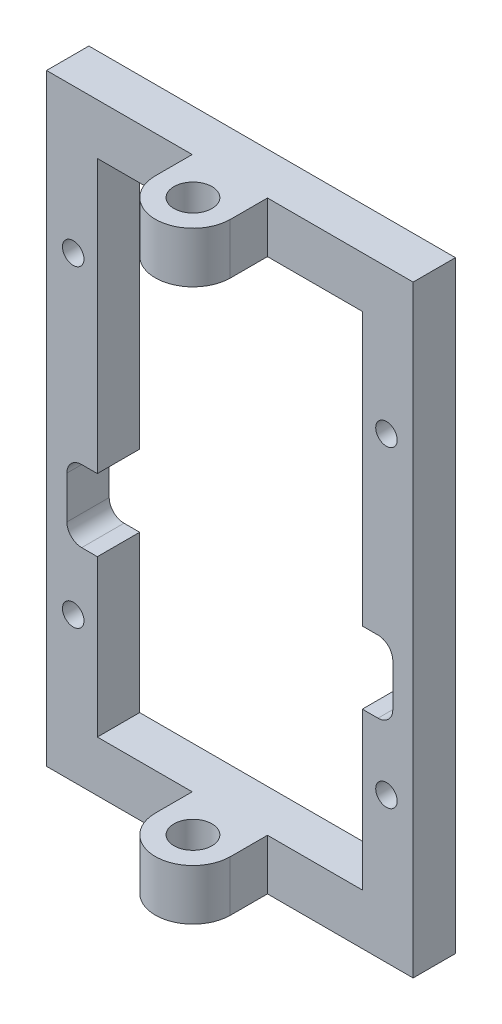
ISO-10303-21;
HEADER;
FILE_DESCRIPTION(('STEP AP214'),'2;1');
FILE_NAME('part.step','',(''),(''),'','','');
FILE_SCHEMA(('AUTOMOTIVE_DESIGN { 1 0 10303 214 1 1 1 1 }'));
ENDSEC;
DATA;
#1=APPLICATION_CONTEXT('core data for automotive mechanical design processes');
#2=APPLICATION_PROTOCOL_DEFINITION('international standard','automotive_design',2000,#1);
#3=PRODUCT_CONTEXT('',#1,'mechanical');
#4=PRODUCT('Part','Part','',(#3));
#5=PRODUCT_RELATED_PRODUCT_CATEGORY('part','',(#4));
#6=PRODUCT_DEFINITION_FORMATION('','',#4);
#7=PRODUCT_DEFINITION_CONTEXT('part definition',#1,'design');
#8=PRODUCT_DEFINITION('design','',#6,#7);
#9=PRODUCT_DEFINITION_SHAPE('','',#8);
#10=(LENGTH_UNIT() NAMED_UNIT(*) SI_UNIT(.MILLI.,.METRE.));
#11=(NAMED_UNIT(*) PLANE_ANGLE_UNIT() SI_UNIT($,.RADIAN.));
#12=(NAMED_UNIT(*) SI_UNIT($,.STERADIAN.) SOLID_ANGLE_UNIT());
#13=UNCERTAINTY_MEASURE_WITH_UNIT(LENGTH_MEASURE(1.E-05),#10,'distance_accuracy_value','');
#14=(GEOMETRIC_REPRESENTATION_CONTEXT(3) GLOBAL_UNCERTAINTY_ASSIGNED_CONTEXT((#13)) GLOBAL_UNIT_ASSIGNED_CONTEXT((#10,
#11,#12)) REPRESENTATION_CONTEXT('',''));
#15=CARTESIAN_POINT('',(0.,0.,0.));
#16=DIRECTION('',(0.,0.,1.));
#17=DIRECTION('',(1.,0.,0.));
#18=AXIS2_PLACEMENT_3D('',#15,#16,#17);
#19=CARTESIAN_POINT('',(0.,0.,5.));
#20=DIRECTION('',(0.,0.,1.));
#21=DIRECTION('',(1.,0.,0.));
#22=AXIS2_PLACEMENT_3D('',#19,#20,#21);
#23=PLANE('',#22);
#24=CARTESIAN_POINT('',(-18.5,-18.495,5.));
#25=DIRECTION('',(0.,0.,-1.));
#26=DIRECTION('',(-1.,0.,0.));
#27=AXIS2_PLACEMENT_3D('',#24,#25,#26);
#28=CIRCLE('',#27,1.27);
#29=CARTESIAN_POINT('',(-19.77,-18.495,5.));
#30=VERTEX_POINT('',#29);
#31=EDGE_CURVE('E745',#30,#30,#28,.T.);
#32=ORIENTED_EDGE('',*,*,#31,.T.);
#33=EDGE_LOOP('',(#32));
#34=FACE_BOUND('',#33,.T.);
#35=CARTESIAN_POINT('',(-18.5,18.495,5.));
#36=DIRECTION('',(0.,0.,-1.));
#37=DIRECTION('',(-1.,0.,0.));
#38=AXIS2_PLACEMENT_3D('',#35,#36,#37);
#39=CIRCLE('',#38,1.27);
#40=CARTESIAN_POINT('',(-19.77,18.495,5.));
#41=VERTEX_POINT('',#40);
#42=EDGE_CURVE('E791',#41,#41,#39,.T.);
#43=ORIENTED_EDGE('',*,*,#42,.T.);
#44=EDGE_LOOP('',(#43));
#45=FACE_BOUND('',#44,.T.);
#46=DIRECTION('',(0.,-1.,0.));
#47=VECTOR('',#46,1.);
#48=CARTESIAN_POINT('',(-15.65,29.595,5.));
#49=LINE('',#48,#47);
#50=CARTESIAN_POINT('',(-15.65,-11.145,5.));
#51=VERTEX_POINT('',#50);
#52=CARTESIAN_POINT('',(-15.65,-29.595,5.));
#53=VERTEX_POINT('',#52);
#54=EDGE_CURVE('E511',#51,#53,#49,.T.);
#55=ORIENTED_EDGE('',*,*,#54,.F.);
#56=DIRECTION('',(1.,0.,0.));
#57=VECTOR('',#56,1.);
#58=CARTESIAN_POINT('',(0.,-11.145,5.));
#59=LINE('',#58,#57);
#60=CARTESIAN_POINT('',(-17.5,-11.145,5.));
#61=VERTEX_POINT('',#60);
#62=EDGE_CURVE('E349',#61,#51,#59,.T.);
#63=ORIENTED_EDGE('',*,*,#62,.F.);
#64=CARTESIAN_POINT('',(-17.5,-9.395,5.));
#65=DIRECTION('',(0.,0.,-1.));
#66=DIRECTION('',(-1.,0.,0.));
#67=AXIS2_PLACEMENT_3D('',#64,#65,#66);
#68=CIRCLE('',#67,1.75);
#69=CARTESIAN_POINT('',(-19.25,-9.395,5.));
#70=VERTEX_POINT('',#69);
#71=EDGE_CURVE('E318',#61,#70,#68,.T.);
#72=ORIENTED_EDGE('',*,*,#71,.T.);
#73=DIRECTION('',(0.,-1.,0.));
#74=VECTOR('',#73,1.);
#75=CARTESIAN_POINT('',(-19.25,0.,5.));
#76=LINE('',#75,#74);
#77=CARTESIAN_POINT('',(-19.25,-4.395,5.));
#78=VERTEX_POINT('',#77);
#79=EDGE_CURVE('E361',#78,#70,#76,.T.);
#80=ORIENTED_EDGE('',*,*,#79,.F.);
#81=CARTESIAN_POINT('',(-17.5,-4.395,5.));
#82=DIRECTION('',(0.,0.,-1.));
#83=DIRECTION('',(-1.,0.,0.));
#84=AXIS2_PLACEMENT_3D('',#81,#82,#83);
#85=CIRCLE('',#84,1.75);
#86=CARTESIAN_POINT('',(-17.5,-2.645,5.));
#87=VERTEX_POINT('',#86);
#88=EDGE_CURVE('E357',#78,#87,#85,.T.);
#89=ORIENTED_EDGE('',*,*,#88,.T.);
#90=DIRECTION('',(1.,0.,0.));
#91=VECTOR('',#90,1.);
#92=CARTESIAN_POINT('',(0.,-2.64499999999999,5.));
#93=LINE('',#92,#91);
#94=CARTESIAN_POINT('',(-15.65,-2.645,5.));
#95=VERTEX_POINT('',#94);
#96=EDGE_CURVE('E352',#87,#95,#93,.T.);
#97=ORIENTED_EDGE('',*,*,#96,.T.);
#98=CARTESIAN_POINT('',(-15.65,29.595,5.));
#99=VERTEX_POINT('',#98);
#100=EDGE_CURVE('E506',#99,#95,#49,.T.);
#101=ORIENTED_EDGE('',*,*,#100,.F.);
#102=DIRECTION('',(-1.,0.,0.));
#103=VECTOR('',#102,1.);
#104=CARTESIAN_POINT('',(-15.65,29.595,5.));
#105=LINE('',#104,#103);
#106=CARTESIAN_POINT('',(-4.445,29.595,5.));
#107=VERTEX_POINT('',#106);
#108=EDGE_CURVE('E521',#107,#99,#105,.T.);
#109=ORIENTED_EDGE('',*,*,#108,.F.);
#110=DIRECTION('',(0.,-1.,0.));
#111=VECTOR('',#110,1.);
#112=CARTESIAN_POINT('',(-4.445,35.595,5.));
#113=LINE('',#112,#111);
#114=CARTESIAN_POINT('',(-4.445,35.595,5.));
#115=VERTEX_POINT('',#114);
#116=EDGE_CURVE('E485',#115,#107,#113,.T.);
#117=ORIENTED_EDGE('',*,*,#116,.F.);
#118=DIRECTION('',(-1.,0.,0.));
#119=VECTOR('',#118,1.);
#120=CARTESIAN_POINT('',(-21.65,35.595,5.));
#121=LINE('',#120,#119);
#122=CARTESIAN_POINT('',(-21.65,35.595,5.));
#123=VERTEX_POINT('',#122);
#124=EDGE_CURVE('E572',#115,#123,#121,.T.);
#125=ORIENTED_EDGE('',*,*,#124,.T.);
#126=DIRECTION('',(0.,-1.,0.));
#127=VECTOR('',#126,1.);
#128=CARTESIAN_POINT('',(-21.65,35.595,5.));
#129=LINE('',#128,#127);
#130=CARTESIAN_POINT('',(-21.65,-35.595,5.));
#131=VERTEX_POINT('',#130);
#132=EDGE_CURVE('E559',#123,#131,#129,.T.);
#133=ORIENTED_EDGE('',*,*,#132,.T.);
#134=DIRECTION('',(1.,0.,0.));
#135=VECTOR('',#134,1.);
#136=CARTESIAN_POINT('',(-21.65,-35.595,5.));
#137=LINE('',#136,#135);
#138=CARTESIAN_POINT('',(-4.445,-35.595,5.));
#139=VERTEX_POINT('',#138);
#140=EDGE_CURVE('E565',#131,#139,#137,.T.);
#141=ORIENTED_EDGE('',*,*,#140,.T.);
#142=DIRECTION('',(0.,-1.,0.));
#143=VECTOR('',#142,1.);
#144=CARTESIAN_POINT('',(-4.445,-29.595,5.));
#145=LINE('',#144,#143);
#146=CARTESIAN_POINT('',(-4.445,-29.595,5.));
#147=VERTEX_POINT('',#146);
#148=EDGE_CURVE('E481',#147,#139,#145,.T.);
#149=ORIENTED_EDGE('',*,*,#148,.F.);
#150=DIRECTION('',(1.,0.,0.));
#151=VECTOR('',#150,1.);
#152=CARTESIAN_POINT('',(-15.65,-29.595,5.));
#153=LINE('',#152,#151);
#154=EDGE_CURVE('E512',#53,#147,#153,.T.);
#155=ORIENTED_EDGE('',*,*,#154,.F.);
#156=EDGE_LOOP('',(#55,#63,#72,#80,#89,#97,#101,#109,#117,#125,#133,#141,#149,#155));
#157=FACE_BOUND('',#156,.T.);
#158=ADVANCED_FACE('F122',(#34,#45,#157),#23,.T.);
#159=CARTESIAN_POINT('',(18.5,18.49499991,5.));
#160=DIRECTION('',(0.,0.,-1.));
#161=DIRECTION('',(-1.,0.,0.));
#162=AXIS2_PLACEMENT_3D('',#159,#160,#161);
#163=CIRCLE('',#162,1.27);
#164=CARTESIAN_POINT('',(17.23,18.49499991,5.));
#165=VERTEX_POINT('',#164);
#166=EDGE_CURVE('E369',#165,#165,#163,.T.);
#167=ORIENTED_EDGE('',*,*,#166,.T.);
#168=EDGE_LOOP('',(#167));
#169=FACE_BOUND('',#168,.T.);
#170=CARTESIAN_POINT('',(18.49999995,-18.4398880645368,5.));
#171=DIRECTION('',(0.,0.,-1.));
#172=DIRECTION('',(-1.,0.,0.));
#173=AXIS2_PLACEMENT_3D('',#170,#171,#172);
#174=CIRCLE('',#173,1.27);
#175=CARTESIAN_POINT('',(17.22999995,-18.4398880645368,5.));
#176=VERTEX_POINT('',#175);
#177=EDGE_CURVE('E780',#176,#176,#174,.T.);
#178=ORIENTED_EDGE('',*,*,#177,.T.);
#179=EDGE_LOOP('',(#178));
#180=FACE_BOUND('',#179,.T.);
#181=DIRECTION('',(0.,1.,0.));
#182=VECTOR('',#181,1.);
#183=CARTESIAN_POINT('',(15.65,29.595,5.));
#184=LINE('',#183,#182);
#185=CARTESIAN_POINT('',(15.65,-2.58988806453678,5.));
#186=VERTEX_POINT('',#185);
#187=CARTESIAN_POINT('',(15.65,29.595,5.));
#188=VERTEX_POINT('',#187);
#189=EDGE_CURVE('E516',#186,#188,#184,.T.);
#190=ORIENTED_EDGE('',*,*,#189,.F.);
#191=DIRECTION('',(-1.,0.,0.));
#192=VECTOR('',#191,1.);
#193=CARTESIAN_POINT('',(0.,-2.58988806453677,5.));
#194=LINE('',#193,#192);
#195=CARTESIAN_POINT('',(17.5,-2.58988806453678,5.));
#196=VERTEX_POINT('',#195);
#197=EDGE_CURVE('E374',#196,#186,#194,.T.);
#198=ORIENTED_EDGE('',*,*,#197,.F.);
#199=CARTESIAN_POINT('',(17.5,-4.33988806453679,5.));
#200=DIRECTION('',(0.,0.,-1.));
#201=DIRECTION('',(-1.,0.,0.));
#202=AXIS2_PLACEMENT_3D('',#199,#200,#201);
#203=CIRCLE('',#202,1.75);
#204=CARTESIAN_POINT('',(19.25,-4.33988806453679,5.));
#205=VERTEX_POINT('',#204);
#206=EDGE_CURVE('E377',#196,#205,#203,.T.);
#207=ORIENTED_EDGE('',*,*,#206,.T.);
#208=DIRECTION('',(0.,-1.,0.));
#209=VECTOR('',#208,1.);
#210=CARTESIAN_POINT('',(19.25,0.,5.));
#211=LINE('',#210,#209);
#212=CARTESIAN_POINT('',(19.25,-9.33988806453679,5.));
#213=VERTEX_POINT('',#212);
#214=EDGE_CURVE('E381',#205,#213,#211,.T.);
#215=ORIENTED_EDGE('',*,*,#214,.T.);
#216=CARTESIAN_POINT('',(17.5,-9.33988806453679,5.));
#217=DIRECTION('',(0.,0.,-1.));
#218=DIRECTION('',(-1.,0.,0.));
#219=AXIS2_PLACEMENT_3D('',#216,#217,#218);
#220=CIRCLE('',#219,1.75);
#221=CARTESIAN_POINT('',(17.5,-11.0898880645368,5.));
#222=VERTEX_POINT('',#221);
#223=EDGE_CURVE('E385',#213,#222,#220,.T.);
#224=ORIENTED_EDGE('',*,*,#223,.T.);
#225=DIRECTION('',(-1.,0.,0.));
#226=VECTOR('',#225,1.);
#227=CARTESIAN_POINT('',(0.,-11.0898880645368,5.));
#228=LINE('',#227,#226);
#229=CARTESIAN_POINT('',(15.65,-11.0898880645368,5.));
#230=VERTEX_POINT('',#229);
#231=EDGE_CURVE('E389',#222,#230,#228,.T.);
#232=ORIENTED_EDGE('',*,*,#231,.T.);
#233=CARTESIAN_POINT('',(15.65,-29.595,5.));
#234=VERTEX_POINT('',#233);
#235=EDGE_CURVE('E517',#234,#230,#184,.T.);
#236=ORIENTED_EDGE('',*,*,#235,.F.);
#237=CARTESIAN_POINT('',(4.445,-29.595,5.));
#238=VERTEX_POINT('',#237);
#239=EDGE_CURVE('E510',#238,#234,#153,.T.);
#240=ORIENTED_EDGE('',*,*,#239,.F.);
#241=DIRECTION('',(0.,-1.,0.));
#242=VECTOR('',#241,1.);
#243=CARTESIAN_POINT('',(4.445,-29.595,5.));
#244=LINE('',#243,#242);
#245=CARTESIAN_POINT('',(4.445,-35.595,5.));
#246=VERTEX_POINT('',#245);
#247=EDGE_CURVE('E477',#238,#246,#244,.T.);
#248=ORIENTED_EDGE('',*,*,#247,.T.);
#249=CARTESIAN_POINT('',(21.65,-35.595,5.));
#250=VERTEX_POINT('',#249);
#251=EDGE_CURVE('E563',#246,#250,#137,.T.);
#252=ORIENTED_EDGE('',*,*,#251,.T.);
#253=DIRECTION('',(0.,1.,0.));
#254=VECTOR('',#253,1.);
#255=CARTESIAN_POINT('',(21.65,35.595,5.));
#256=LINE('',#255,#254);
#257=CARTESIAN_POINT('',(21.65,35.595,5.));
#258=VERTEX_POINT('',#257);
#259=EDGE_CURVE('E569',#250,#258,#256,.T.);
#260=ORIENTED_EDGE('',*,*,#259,.T.);
#261=CARTESIAN_POINT('',(4.445,35.595,5.));
#262=VERTEX_POINT('',#261);
#263=EDGE_CURVE('E573',#258,#262,#121,.T.);
#264=ORIENTED_EDGE('',*,*,#263,.T.);
#265=DIRECTION('',(0.,-1.,0.));
#266=VECTOR('',#265,1.);
#267=CARTESIAN_POINT('',(4.445,35.595,5.));
#268=LINE('',#267,#266);
#269=CARTESIAN_POINT('',(4.445,29.595,5.));
#270=VERTEX_POINT('',#269);
#271=EDGE_CURVE('E489',#262,#270,#268,.T.);
#272=ORIENTED_EDGE('',*,*,#271,.T.);
#273=EDGE_CURVE('E522',#188,#270,#105,.T.);
#274=ORIENTED_EDGE('',*,*,#273,.F.);
#275=EDGE_LOOP('',(#190,#198,#207,#215,#224,#232,#236,#240,#248,#252,#260,#264,#272,#274));
#276=FACE_BOUND('',#275,.T.);
#277=ADVANCED_FACE('F624',(#169,#180,#276),#23,.T.);
#278=CARTESIAN_POINT('',(0.,0.,0.));
#279=DIRECTION('',(0.,0.,1.));
#280=DIRECTION('',(1.,0.,0.));
#281=AXIS2_PLACEMENT_3D('',#278,#279,#280);
#282=PLANE('',#281);
#283=CARTESIAN_POINT('',(-18.5,-18.495,0.));
#284=DIRECTION('',(0.,0.,-1.));
#285=DIRECTION('',(-1.,0.,0.));
#286=AXIS2_PLACEMENT_3D('',#283,#284,#285);
#287=CIRCLE('',#286,1.27);
#288=CARTESIAN_POINT('',(-19.77,-18.495,0.));
#289=VERTEX_POINT('',#288);
#290=EDGE_CURVE('E784',#289,#289,#287,.T.);
#291=ORIENTED_EDGE('',*,*,#290,.F.);
#292=EDGE_LOOP('',(#291));
#293=FACE_BOUND('',#292,.T.);
#294=CARTESIAN_POINT('',(-18.5,18.495,0.));
#295=DIRECTION('',(0.,0.,-1.));
#296=DIRECTION('',(-1.,0.,0.));
#297=AXIS2_PLACEMENT_3D('',#294,#295,#296);
#298=CIRCLE('',#297,1.27);
#299=CARTESIAN_POINT('',(-19.77,18.495,0.));
#300=VERTEX_POINT('',#299);
#301=EDGE_CURVE('E373',#300,#300,#298,.T.);
#302=ORIENTED_EDGE('',*,*,#301,.F.);
#303=EDGE_LOOP('',(#302));
#304=FACE_BOUND('',#303,.T.);
#305=CARTESIAN_POINT('',(18.5,18.49499991,0.));
#306=DIRECTION('',(0.,0.,-1.));
#307=DIRECTION('',(-1.,0.,0.));
#308=AXIS2_PLACEMENT_3D('',#305,#306,#307);
#309=CIRCLE('',#308,1.27);
#310=CARTESIAN_POINT('',(17.23,18.49499991,0.));
#311=VERTEX_POINT('',#310);
#312=EDGE_CURVE('E323',#311,#311,#309,.T.);
#313=ORIENTED_EDGE('',*,*,#312,.F.);
#314=EDGE_LOOP('',(#313));
#315=FACE_BOUND('',#314,.T.);
#316=DIRECTION('',(0.,-1.,0.));
#317=VECTOR('',#316,1.);
#318=CARTESIAN_POINT('',(-21.65,35.595,0.));
#319=LINE('',#318,#317);
#320=CARTESIAN_POINT('',(-21.65,35.595,0.));
#321=VERTEX_POINT('',#320);
#322=CARTESIAN_POINT('',(-21.65,-35.595,0.));
#323=VERTEX_POINT('',#322);
#324=EDGE_CURVE('E558',#321,#323,#319,.T.);
#325=ORIENTED_EDGE('',*,*,#324,.F.);
#326=DIRECTION('',(-1.,0.,0.));
#327=VECTOR('',#326,1.);
#328=CARTESIAN_POINT('',(-21.65,35.595,0.));
#329=LINE('',#328,#327);
#330=CARTESIAN_POINT('',(21.65,35.595,0.));
#331=VERTEX_POINT('',#330);
#332=EDGE_CURVE('E564',#331,#321,#329,.T.);
#333=ORIENTED_EDGE('',*,*,#332,.F.);
#334=DIRECTION('',(0.,1.,0.));
#335=VECTOR('',#334,1.);
#336=CARTESIAN_POINT('',(21.65,35.595,0.));
#337=LINE('',#336,#335);
#338=CARTESIAN_POINT('',(21.65,-35.595,0.));
#339=VERTEX_POINT('',#338);
#340=EDGE_CURVE('E584',#339,#331,#337,.T.);
#341=ORIENTED_EDGE('',*,*,#340,.F.);
#342=DIRECTION('',(1.,0.,0.));
#343=VECTOR('',#342,1.);
#344=CARTESIAN_POINT('',(-21.65,-35.595,0.));
#345=LINE('',#344,#343);
#346=EDGE_CURVE('E581',#323,#339,#345,.T.);
#347=ORIENTED_EDGE('',*,*,#346,.F.);
#348=EDGE_LOOP('',(#325,#333,#341,#347));
#349=FACE_BOUND('',#348,.T.);
#350=CARTESIAN_POINT('',(18.49999995,-18.4398880645368,0.));
#351=DIRECTION('',(0.,0.,-1.));
#352=DIRECTION('',(-1.,0.,0.));
#353=AXIS2_PLACEMENT_3D('',#350,#351,#352);
#354=CIRCLE('',#353,1.27);
#355=CARTESIAN_POINT('',(17.22999995,-18.4398880645368,0.));
#356=VERTEX_POINT('',#355);
#357=EDGE_CURVE('E777',#356,#356,#354,.T.);
#358=ORIENTED_EDGE('',*,*,#357,.F.);
#359=EDGE_LOOP('',(#358));
#360=FACE_BOUND('',#359,.T.);
#361=DIRECTION('',(1.,0.,0.));
#362=VECTOR('',#361,1.);
#363=CARTESIAN_POINT('',(0.,-11.145,0.));
#364=LINE('',#363,#362);
#365=CARTESIAN_POINT('',(-17.5,-11.145,0.));
#366=VERTEX_POINT('',#365);
#367=CARTESIAN_POINT('',(-15.65,-11.145,0.));
#368=VERTEX_POINT('',#367);
#369=EDGE_CURVE('E326',#366,#368,#364,.T.);
#370=ORIENTED_EDGE('',*,*,#369,.T.);
#371=DIRECTION('',(0.,-1.,0.));
#372=VECTOR('',#371,1.);
#373=CARTESIAN_POINT('',(-15.65,29.595,0.));
#374=LINE('',#373,#372);
#375=CARTESIAN_POINT('',(-15.65,-29.595,0.));
#376=VERTEX_POINT('',#375);
#377=EDGE_CURVE('E505',#368,#376,#374,.T.);
#378=ORIENTED_EDGE('',*,*,#377,.T.);
#379=DIRECTION('',(1.,0.,0.));
#380=VECTOR('',#379,1.);
#381=CARTESIAN_POINT('',(-15.65,-29.595,0.));
#382=LINE('',#381,#380);
#383=CARTESIAN_POINT('',(15.65,-29.595,0.));
#384=VERTEX_POINT('',#383);
#385=EDGE_CURVE('E531',#376,#384,#382,.T.);
#386=ORIENTED_EDGE('',*,*,#385,.T.);
#387=DIRECTION('',(0.,1.,0.));
#388=VECTOR('',#387,1.);
#389=CARTESIAN_POINT('',(15.65,29.595,0.));
#390=LINE('',#389,#388);
#391=CARTESIAN_POINT('',(15.65,-11.0898880645368,0.));
#392=VERTEX_POINT('',#391);
#393=EDGE_CURVE('E536',#384,#392,#390,.T.);
#394=ORIENTED_EDGE('',*,*,#393,.T.);
#395=DIRECTION('',(-1.,0.,0.));
#396=VECTOR('',#395,1.);
#397=CARTESIAN_POINT('',(0.,-11.0898880645368,0.));
#398=LINE('',#397,#396);
#399=CARTESIAN_POINT('',(17.5,-11.0898880645368,0.));
#400=VERTEX_POINT('',#399);
#401=EDGE_CURVE('E148',#400,#392,#398,.T.);
#402=ORIENTED_EDGE('',*,*,#401,.F.);
#403=CARTESIAN_POINT('',(17.5,-9.33988806453679,0.));
#404=DIRECTION('',(0.,0.,-1.));
#405=DIRECTION('',(-1.,0.,0.));
#406=AXIS2_PLACEMENT_3D('',#403,#404,#405);
#407=CIRCLE('',#406,1.75);
#408=CARTESIAN_POINT('',(19.25,-9.33988806453679,0.));
#409=VERTEX_POINT('',#408);
#410=EDGE_CURVE('E401',#409,#400,#407,.T.);
#411=ORIENTED_EDGE('',*,*,#410,.F.);
#412=DIRECTION('',(0.,-1.,0.));
#413=VECTOR('',#412,1.);
#414=CARTESIAN_POINT('',(19.25,0.,0.));
#415=LINE('',#414,#413);
#416=CARTESIAN_POINT('',(19.25,-4.33988806453679,0.));
#417=VERTEX_POINT('',#416);
#418=EDGE_CURVE('E397',#417,#409,#415,.T.);
#419=ORIENTED_EDGE('',*,*,#418,.F.);
#420=CARTESIAN_POINT('',(17.5,-4.33988806453679,0.));
#421=DIRECTION('',(0.,0.,-1.));
#422=DIRECTION('',(-1.,0.,0.));
#423=AXIS2_PLACEMENT_3D('',#420,#421,#422);
#424=CIRCLE('',#423,1.75);
#425=CARTESIAN_POINT('',(17.5,-2.58988806453678,0.));
#426=VERTEX_POINT('',#425);
#427=EDGE_CURVE('E343',#426,#417,#424,.T.);
#428=ORIENTED_EDGE('',*,*,#427,.F.);
#429=DIRECTION('',(-1.,0.,0.));
#430=VECTOR('',#429,1.);
#431=CARTESIAN_POINT('',(0.,-2.58988806453677,0.));
#432=LINE('',#431,#430);
#433=CARTESIAN_POINT('',(15.65,-2.58988806453678,0.));
#434=VERTEX_POINT('',#433);
#435=EDGE_CURVE('E338',#426,#434,#432,.T.);
#436=ORIENTED_EDGE('',*,*,#435,.T.);
#437=CARTESIAN_POINT('',(15.65,29.595,0.));
#438=VERTEX_POINT('',#437);
#439=EDGE_CURVE('E535',#434,#438,#390,.T.);
#440=ORIENTED_EDGE('',*,*,#439,.T.);
#441=DIRECTION('',(-1.,0.,0.));
#442=VECTOR('',#441,1.);
#443=CARTESIAN_POINT('',(-15.65,29.595,0.));
#444=LINE('',#443,#442);
#445=CARTESIAN_POINT('',(-15.65,29.595,0.));
#446=VERTEX_POINT('',#445);
#447=EDGE_CURVE('E540',#438,#446,#444,.T.);
#448=ORIENTED_EDGE('',*,*,#447,.T.);
#449=CARTESIAN_POINT('',(-15.65,-2.645,0.));
#450=VERTEX_POINT('',#449);
#451=EDGE_CURVE('E527',#446,#450,#374,.T.);
#452=ORIENTED_EDGE('',*,*,#451,.T.);
#453=DIRECTION('',(1.,0.,0.));
#454=VECTOR('',#453,1.);
#455=CARTESIAN_POINT('',(0.,-2.64499999999999,0.));
#456=LINE('',#455,#454);
#457=CARTESIAN_POINT('',(-17.5,-2.645,0.));
#458=VERTEX_POINT('',#457);
#459=EDGE_CURVE('E140',#458,#450,#456,.T.);
#460=ORIENTED_EDGE('',*,*,#459,.F.);
#461=CARTESIAN_POINT('',(-17.5,-4.395,0.));
#462=DIRECTION('',(0.,0.,-1.));
#463=DIRECTION('',(-1.,0.,0.));
#464=AXIS2_PLACEMENT_3D('',#461,#462,#463);
#465=CIRCLE('',#464,1.75);
#466=CARTESIAN_POINT('',(-19.25,-4.395,0.));
#467=VERTEX_POINT('',#466);
#468=EDGE_CURVE('E345',#467,#458,#465,.T.);
#469=ORIENTED_EDGE('',*,*,#468,.F.);
#470=DIRECTION('',(0.,-1.,0.));
#471=VECTOR('',#470,1.);
#472=CARTESIAN_POINT('',(-19.25,0.,0.));
#473=LINE('',#472,#471);
#474=CARTESIAN_POINT('',(-19.25,-9.395,0.));
#475=VERTEX_POINT('',#474);
#476=EDGE_CURVE('E336',#467,#475,#473,.T.);
#477=ORIENTED_EDGE('',*,*,#476,.T.);
#478=CARTESIAN_POINT('',(-17.5,-9.395,0.));
#479=DIRECTION('',(0.,0.,-1.));
#480=DIRECTION('',(-1.,0.,0.));
#481=AXIS2_PLACEMENT_3D('',#478,#479,#480);
#482=CIRCLE('',#481,1.75);
#483=EDGE_CURVE('E315',#366,#475,#482,.T.);
#484=ORIENTED_EDGE('',*,*,#483,.F.);
#485=EDGE_LOOP('',(#370,#378,#386,#394,#402,#411,#419,#428,#436,#440,#448,#452,#460,#469,#477,#484));
#486=FACE_BOUND('',#485,.T.);
#487=ADVANCED_FACE('F333',(#293,#304,#315,#349,#360,#486),#282,.F.);
#488=CARTESIAN_POINT('',(-15.65,29.595,5.));
#489=DIRECTION('',(1.,0.,0.));
#490=DIRECTION('',(0.,1.,0.));
#491=AXIS2_PLACEMENT_3D('',#488,#489,#490);
#492=PLANE('',#491);
#493=ORIENTED_EDGE('',*,*,#377,.F.);
#494=DIRECTION('',(0.,0.,-1.));
#495=VECTOR('',#494,1.);
#496=CARTESIAN_POINT('',(-15.65,-11.145,5.));
#497=LINE('',#496,#495);
#498=EDGE_CURVE('E322',#51,#368,#497,.T.);
#499=ORIENTED_EDGE('',*,*,#498,.F.);
#500=ORIENTED_EDGE('',*,*,#54,.T.);
#501=DIRECTION('',(0.,0.,-1.));
#502=VECTOR('',#501,1.);
#503=CARTESIAN_POINT('',(-15.65,-29.595,5.));
#504=LINE('',#503,#502);
#505=EDGE_CURVE('E554',#53,#376,#504,.T.);
#506=ORIENTED_EDGE('',*,*,#505,.T.);
#507=EDGE_LOOP('',(#493,#499,#500,#506));
#508=FACE_BOUND('',#507,.T.);
#509=ADVANCED_FACE('F639',(#508),#492,.T.);
#510=CARTESIAN_POINT('',(15.65,29.595,5.));
#511=DIRECTION('',(-1.,0.,0.));
#512=DIRECTION('',(0.,-1.,0.));
#513=AXIS2_PLACEMENT_3D('',#510,#511,#512);
#514=PLANE('',#513);
#515=ORIENTED_EDGE('',*,*,#439,.F.);
#516=DIRECTION('',(0.,0.,-1.));
#517=VECTOR('',#516,1.);
#518=CARTESIAN_POINT('',(15.65,-2.58988806453678,5.));
#519=LINE('',#518,#517);
#520=EDGE_CURVE('E407',#186,#434,#519,.T.);
#521=ORIENTED_EDGE('',*,*,#520,.F.);
#522=ORIENTED_EDGE('',*,*,#189,.T.);
#523=DIRECTION('',(0.,0.,-1.));
#524=VECTOR('',#523,1.);
#525=CARTESIAN_POINT('',(15.65,29.595,5.));
#526=LINE('',#525,#524);
#527=EDGE_CURVE('E547',#188,#438,#526,.T.);
#528=ORIENTED_EDGE('',*,*,#527,.T.);
#529=EDGE_LOOP('',(#515,#521,#522,#528));
#530=FACE_BOUND('',#529,.T.);
#531=ADVANCED_FACE('F648',(#530),#514,.T.);
#532=CARTESIAN_POINT('',(-21.65,-35.595,5.));
#533=DIRECTION('',(0.,1.,0.));
#534=DIRECTION('',(0.,0.,1.));
#535=AXIS2_PLACEMENT_3D('',#532,#533,#534);
#536=PLANE('',#535);
#537=DIRECTION('',(0.,0.,-1.));
#538=VECTOR('',#537,1.);
#539=CARTESIAN_POINT('',(4.445,-35.595,13.8));
#540=LINE('',#539,#538);
#541=CARTESIAN_POINT('',(4.445,-35.595,9.40000000000001));
#542=VERTEX_POINT('',#541);
#543=EDGE_CURVE('E468',#542,#246,#540,.T.);
#544=ORIENTED_EDGE('',*,*,#543,.F.);
#545=CARTESIAN_POINT('',(0.,-35.595,9.35476988636363));
#546=DIRECTION('',(0.,1.,0.));
#547=DIRECTION('',(0.,0.,1.));
#548=AXIS2_PLACEMENT_3D('',#545,#546,#547);
#549=CIRCLE('',#548,4.44523011363636);
#550=CARTESIAN_POINT('',(-4.445,-35.595,9.40000000000001));
#551=VERTEX_POINT('',#550);
#552=EDGE_CURVE('E446',#542,#551,#549,.F.);
#553=ORIENTED_EDGE('',*,*,#552,.T.);
#554=DIRECTION('',(0.,0.,-1.));
#555=VECTOR('',#554,1.);
#556=CARTESIAN_POINT('',(-4.445,-35.595,13.8));
#557=LINE('',#556,#555);
#558=EDGE_CURVE('E465',#551,#139,#557,.T.);
#559=ORIENTED_EDGE('',*,*,#558,.T.);
#560=ORIENTED_EDGE('',*,*,#140,.F.);
#561=DIRECTION('',(0.,0.,-1.));
#562=VECTOR('',#561,1.);
#563=CARTESIAN_POINT('',(-21.65,-35.595,5.));
#564=LINE('',#563,#562);
#565=EDGE_CURVE('E12',#131,#323,#564,.T.);
#566=ORIENTED_EDGE('',*,*,#565,.T.);
#567=ORIENTED_EDGE('',*,*,#346,.T.);
#568=DIRECTION('',(0.,0.,-1.));
#569=VECTOR('',#568,1.);
#570=CARTESIAN_POINT('',(21.65,-35.595,5.));
#571=LINE('',#570,#569);
#572=EDGE_CURVE('E132',#250,#339,#571,.T.);
#573=ORIENTED_EDGE('',*,*,#572,.F.);
#574=ORIENTED_EDGE('',*,*,#251,.F.);
#575=EDGE_LOOP('',(#544,#553,#559,#560,#566,#567,#573,#574));
#576=FACE_BOUND('',#575,.T.);
#577=CARTESIAN_POINT('',(0.,-35.595,9.35476988636363));
#578=DIRECTION('',(0.,1.,0.));
#579=DIRECTION('',(0.,0.,1.));
#580=AXIS2_PLACEMENT_3D('',#577,#578,#579);
#581=CIRCLE('',#580,2.2479);
#582=CARTESIAN_POINT('',(0.,-35.595,11.6026698863636));
#583=VERTEX_POINT('',#582);
#584=EDGE_CURVE('E410',#583,#583,#581,.T.);
#585=ORIENTED_EDGE('',*,*,#584,.T.);
#586=EDGE_LOOP('',(#585));
#587=FACE_BOUND('',#586,.T.);
#588=ADVANCED_FACE('F643',(#576,#587),#536,.F.);
#589=CARTESIAN_POINT('',(-21.65,35.595,5.));
#590=DIRECTION('',(0.,-1.,0.));
#591=DIRECTION('',(0.,0.,-1.));
#592=AXIS2_PLACEMENT_3D('',#589,#590,#591);
#593=PLANE('',#592);
#594=CARTESIAN_POINT('',(0.,35.595,9.35476988636363));
#595=DIRECTION('',(0.,1.,0.));
#596=DIRECTION('',(0.,0.,1.));
#597=AXIS2_PLACEMENT_3D('',#594,#595,#596);
#598=CIRCLE('',#597,4.44523011363636);
#599=CARTESIAN_POINT('',(4.445,35.595,9.40000000000001));
#600=VERTEX_POINT('',#599);
#601=CARTESIAN_POINT('',(-4.445,35.595,9.40000000000001));
#602=VERTEX_POINT('',#601);
#603=EDGE_CURVE('E126',#600,#602,#598,.F.);
#604=ORIENTED_EDGE('',*,*,#603,.F.);
#605=DIRECTION('',(0.,0.,-1.));
#606=VECTOR('',#605,1.);
#607=CARTESIAN_POINT('',(4.445,35.595,13.8));
#608=LINE('',#607,#606);
#609=EDGE_CURVE('E496',#600,#262,#608,.T.);
#610=ORIENTED_EDGE('',*,*,#609,.T.);
#611=ORIENTED_EDGE('',*,*,#263,.F.);
#612=DIRECTION('',(0.,0.,-1.));
#613=VECTOR('',#612,1.);
#614=CARTESIAN_POINT('',(21.65,35.595,5.));
#615=LINE('',#614,#613);
#616=EDGE_CURVE('E592',#258,#331,#615,.T.);
#617=ORIENTED_EDGE('',*,*,#616,.T.);
#618=ORIENTED_EDGE('',*,*,#332,.T.);
#619=DIRECTION('',(0.,0.,-1.));
#620=VECTOR('',#619,1.);
#621=CARTESIAN_POINT('',(-21.65,35.595,5.));
#622=LINE('',#621,#620);
#623=EDGE_CURVE('E577',#123,#321,#622,.T.);
#624=ORIENTED_EDGE('',*,*,#623,.F.);
#625=ORIENTED_EDGE('',*,*,#124,.F.);
#626=DIRECTION('',(0.,0.,-1.));
#627=VECTOR('',#626,1.);
#628=CARTESIAN_POINT('',(-4.445,35.595,13.8));
#629=LINE('',#628,#627);
#630=EDGE_CURVE('E493',#602,#115,#629,.T.);
#631=ORIENTED_EDGE('',*,*,#630,.F.);
#632=EDGE_LOOP('',(#604,#610,#611,#617,#618,#624,#625,#631));
#633=FACE_BOUND('',#632,.T.);
#634=CARTESIAN_POINT('',(0.,35.595,9.35476988636363));
#635=DIRECTION('',(0.,-1.,0.));
#636=DIRECTION('',(0.,0.,-1.));
#637=AXIS2_PLACEMENT_3D('',#634,#635,#636);
#638=CIRCLE('',#637,2.2479);
#639=CARTESIAN_POINT('',(0.,35.595,7.10686988636363));
#640=VERTEX_POINT('',#639);
#641=EDGE_CURVE('E442',#640,#640,#638,.T.);
#642=ORIENTED_EDGE('',*,*,#641,.T.);
#643=EDGE_LOOP('',(#642));
#644=FACE_BOUND('',#643,.T.);
#645=ADVANCED_FACE('F617',(#633,#644),#593,.F.);
#646=CARTESIAN_POINT('',(-15.65,-29.595,5.));
#647=DIRECTION('',(0.,1.,0.));
#648=DIRECTION('',(0.,0.,1.));
#649=AXIS2_PLACEMENT_3D('',#646,#647,#648);
#650=PLANE('',#649);
#651=CARTESIAN_POINT('',(0.,-29.595,9.35476988636363));
#652=DIRECTION('',(0.,1.,0.));
#653=DIRECTION('',(0.,0.,1.));
#654=AXIS2_PLACEMENT_3D('',#651,#652,#653);
#655=CIRCLE('',#654,4.44523011363636);
#656=CARTESIAN_POINT('',(4.445,-29.595,9.40000000000001));
#657=VERTEX_POINT('',#656);
#658=CARTESIAN_POINT('',(-4.445,-29.595,9.40000000000001));
#659=VERTEX_POINT('',#658);
#660=EDGE_CURVE('E462',#657,#659,#655,.F.);
#661=ORIENTED_EDGE('',*,*,#660,.F.);
#662=DIRECTION('',(0.,0.,-1.));
#663=VECTOR('',#662,1.);
#664=CARTESIAN_POINT('',(4.445,-29.595,13.8));
#665=LINE('',#664,#663);
#666=EDGE_CURVE('E471',#657,#238,#665,.T.);
#667=ORIENTED_EDGE('',*,*,#666,.T.);
#668=ORIENTED_EDGE('',*,*,#239,.T.);
#669=DIRECTION('',(0.,0.,-1.));
#670=VECTOR('',#669,1.);
#671=CARTESIAN_POINT('',(15.65,-29.595,5.));
#672=LINE('',#671,#670);
#673=EDGE_CURVE('E551',#234,#384,#672,.T.);
#674=ORIENTED_EDGE('',*,*,#673,.T.);
#675=ORIENTED_EDGE('',*,*,#385,.F.);
#676=ORIENTED_EDGE('',*,*,#505,.F.);
#677=ORIENTED_EDGE('',*,*,#154,.T.);
#678=DIRECTION('',(0.,0.,-1.));
#679=VECTOR('',#678,1.);
#680=CARTESIAN_POINT('',(-4.445,-29.595,13.8));
#681=LINE('',#680,#679);
#682=EDGE_CURVE('E474',#659,#147,#681,.T.);
#683=ORIENTED_EDGE('',*,*,#682,.F.);
#684=EDGE_LOOP('',(#661,#667,#668,#674,#675,#676,#677,#683));
#685=FACE_BOUND('',#684,.T.);
#686=CARTESIAN_POINT('',(0.,-29.595,9.35476988636363));
#687=DIRECTION('',(0.,1.,0.));
#688=DIRECTION('',(0.,0.,1.));
#689=AXIS2_PLACEMENT_3D('',#686,#687,#688);
#690=CIRCLE('',#689,2.2479);
#691=CARTESIAN_POINT('',(0.,-29.595,11.6026698863636));
#692=VERTEX_POINT('',#691);
#693=EDGE_CURVE('E438',#692,#692,#690,.T.);
#694=ORIENTED_EDGE('',*,*,#693,.F.);
#695=EDGE_LOOP('',(#694));
#696=FACE_BOUND('',#695,.T.);
#697=ADVANCED_FACE('F607',(#685,#696),#650,.T.);
#698=CARTESIAN_POINT('',(-15.65,29.595,5.));
#699=DIRECTION('',(0.,-1.,0.));
#700=DIRECTION('',(0.,0.,-1.));
#701=AXIS2_PLACEMENT_3D('',#698,#699,#700);
#702=PLANE('',#701);
#703=DIRECTION('',(0.,0.,-1.));
#704=VECTOR('',#703,1.);
#705=CARTESIAN_POINT('',(4.445,29.595,13.8));
#706=LINE('',#705,#704);
#707=CARTESIAN_POINT('',(4.445,29.595,9.40000000000001));
#708=VERTEX_POINT('',#707);
#709=EDGE_CURVE('E499',#708,#270,#706,.T.);
#710=ORIENTED_EDGE('',*,*,#709,.F.);
#711=CARTESIAN_POINT('',(0.,29.595,9.35476988636363));
#712=DIRECTION('',(0.,-1.,0.));
#713=DIRECTION('',(0.,0.,-1.));
#714=AXIS2_PLACEMENT_3D('',#711,#712,#713);
#715=CIRCLE('',#714,4.44523011363636);
#716=CARTESIAN_POINT('',(-4.445,29.595,9.40000000000001));
#717=VERTEX_POINT('',#716);
#718=EDGE_CURVE('E455',#717,#708,#715,.F.);
#719=ORIENTED_EDGE('',*,*,#718,.F.);
#720=DIRECTION('',(0.,0.,-1.));
#721=VECTOR('',#720,1.);
#722=CARTESIAN_POINT('',(-4.445,29.595,13.8));
#723=LINE('',#722,#721);
#724=EDGE_CURVE('E502',#717,#107,#723,.T.);
#725=ORIENTED_EDGE('',*,*,#724,.T.);
#726=ORIENTED_EDGE('',*,*,#108,.T.);
#727=DIRECTION('',(0.,0.,-1.));
#728=VECTOR('',#727,1.);
#729=CARTESIAN_POINT('',(-15.65,29.595,5.));
#730=LINE('',#729,#728);
#731=EDGE_CURVE('E526',#99,#446,#730,.T.);
#732=ORIENTED_EDGE('',*,*,#731,.T.);
#733=ORIENTED_EDGE('',*,*,#447,.F.);
#734=ORIENTED_EDGE('',*,*,#527,.F.);
#735=ORIENTED_EDGE('',*,*,#273,.T.);
#736=EDGE_LOOP('',(#710,#719,#725,#726,#732,#733,#734,#735));
#737=FACE_BOUND('',#736,.T.);
#738=CARTESIAN_POINT('',(0.,29.595,9.35476988636363));
#739=DIRECTION('',(0.,-1.,0.));
#740=DIRECTION('',(0.,0.,-1.));
#741=AXIS2_PLACEMENT_3D('',#738,#739,#740);
#742=CIRCLE('',#741,2.2479);
#743=CARTESIAN_POINT('',(0.,29.595,7.10686988636363));
#744=VERTEX_POINT('',#743);
#745=EDGE_CURVE('E433',#744,#744,#742,.T.);
#746=ORIENTED_EDGE('',*,*,#745,.F.);
#747=EDGE_LOOP('',(#746));
#748=FACE_BOUND('',#747,.T.);
#749=ADVANCED_FACE('F605',(#737,#748),#702,.T.);
#750=CARTESIAN_POINT('',(-21.65,35.595,5.));
#751=DIRECTION('',(1.,0.,0.));
#752=DIRECTION('',(0.,1.,0.));
#753=AXIS2_PLACEMENT_3D('',#750,#751,#752);
#754=PLANE('',#753);
#755=ORIENTED_EDGE('',*,*,#324,.T.);
#756=ORIENTED_EDGE('',*,*,#565,.F.);
#757=ORIENTED_EDGE('',*,*,#132,.F.);
#758=ORIENTED_EDGE('',*,*,#623,.T.);
#759=EDGE_LOOP('',(#755,#756,#757,#758));
#760=FACE_BOUND('',#759,.T.);
#761=ADVANCED_FACE('F124',(#760),#754,.F.);
#762=CARTESIAN_POINT('',(21.65,35.595,5.));
#763=DIRECTION('',(-1.,0.,0.));
#764=DIRECTION('',(0.,-1.,0.));
#765=AXIS2_PLACEMENT_3D('',#762,#763,#764);
#766=PLANE('',#765);
#767=ORIENTED_EDGE('',*,*,#340,.T.);
#768=ORIENTED_EDGE('',*,*,#616,.F.);
#769=ORIENTED_EDGE('',*,*,#259,.F.);
#770=ORIENTED_EDGE('',*,*,#572,.T.);
#771=EDGE_LOOP('',(#767,#768,#769,#770));
#772=FACE_BOUND('',#771,.T.);
#773=ADVANCED_FACE('F615',(#772),#766,.F.);
#774=DIRECTION('',(0.,0.,-1.));
#775=VECTOR('',#774,1.);
#776=CARTESIAN_POINT('',(-15.65,-2.645,5.));
#777=LINE('',#776,#775);
#778=EDGE_CURVE('E750',#95,#450,#777,.T.);
#779=ORIENTED_EDGE('',*,*,#778,.T.);
#780=ORIENTED_EDGE('',*,*,#451,.F.);
#781=ORIENTED_EDGE('',*,*,#731,.F.);
#782=ORIENTED_EDGE('',*,*,#100,.T.);
#783=EDGE_LOOP('',(#779,#780,#781,#782));
#784=FACE_BOUND('',#783,.T.);
#785=ADVANCED_FACE('F636',(#784),#492,.T.);
#786=DIRECTION('',(0.,0.,-1.));
#787=VECTOR('',#786,1.);
#788=CARTESIAN_POINT('',(15.65,-11.0898880645368,5.));
#789=LINE('',#788,#787);
#790=EDGE_CURVE('E411',#230,#392,#789,.T.);
#791=ORIENTED_EDGE('',*,*,#790,.T.);
#792=ORIENTED_EDGE('',*,*,#393,.F.);
#793=ORIENTED_EDGE('',*,*,#673,.F.);
#794=ORIENTED_EDGE('',*,*,#235,.T.);
#795=EDGE_LOOP('',(#791,#792,#793,#794));
#796=FACE_BOUND('',#795,.T.);
#797=ADVANCED_FACE('F655',(#796),#514,.T.);
#798=CARTESIAN_POINT('',(-4.445,35.595,13.8));
#799=DIRECTION('',(1.,0.,0.));
#800=DIRECTION('',(0.,1.,0.));
#801=AXIS2_PLACEMENT_3D('',#798,#799,#800);
#802=PLANE('',#801);
#803=ORIENTED_EDGE('',*,*,#724,.F.);
#804=DIRECTION('',(0.,1.,0.));
#805=VECTOR('',#804,1.);
#806=CARTESIAN_POINT('',(-4.445,-35.595,9.40000000000001));
#807=LINE('',#806,#805);
#808=EDGE_CURVE('E450',#717,#602,#807,.T.);
#809=ORIENTED_EDGE('',*,*,#808,.T.);
#810=ORIENTED_EDGE('',*,*,#630,.T.);
#811=ORIENTED_EDGE('',*,*,#116,.T.);
#812=EDGE_LOOP('',(#803,#809,#810,#811));
#813=FACE_BOUND('',#812,.T.);
#814=ADVANCED_FACE('F690',(#813),#802,.F.);
#815=CARTESIAN_POINT('',(4.445,35.595,13.8));
#816=DIRECTION('',(1.,0.,0.));
#817=DIRECTION('',(0.,1.,0.));
#818=AXIS2_PLACEMENT_3D('',#815,#816,#817);
#819=PLANE('',#818);
#820=DIRECTION('',(0.,1.,0.));
#821=VECTOR('',#820,1.);
#822=CARTESIAN_POINT('',(4.445,-35.595,9.40000000000001));
#823=LINE('',#822,#821);
#824=EDGE_CURVE('E428',#708,#600,#823,.T.);
#825=ORIENTED_EDGE('',*,*,#824,.F.);
#826=ORIENTED_EDGE('',*,*,#709,.T.);
#827=ORIENTED_EDGE('',*,*,#271,.F.);
#828=ORIENTED_EDGE('',*,*,#609,.F.);
#829=EDGE_LOOP('',(#825,#826,#827,#828));
#830=FACE_BOUND('',#829,.T.);
#831=ADVANCED_FACE('F684',(#830),#819,.T.);
#832=CARTESIAN_POINT('',(-4.445,-29.595,13.8));
#833=DIRECTION('',(1.,0.,0.));
#834=DIRECTION('',(0.,0.,-1.));
#835=AXIS2_PLACEMENT_3D('',#832,#833,#834);
#836=PLANE('',#835);
#837=ORIENTED_EDGE('',*,*,#558,.F.);
#838=EDGE_CURVE('E451',#551,#659,#807,.T.);
#839=ORIENTED_EDGE('',*,*,#838,.T.);
#840=ORIENTED_EDGE('',*,*,#682,.T.);
#841=ORIENTED_EDGE('',*,*,#148,.T.);
#842=EDGE_LOOP('',(#837,#839,#840,#841));
#843=FACE_BOUND('',#842,.T.);
#844=ADVANCED_FACE('F680',(#843),#836,.F.);
#845=CARTESIAN_POINT('',(4.445,-29.595,13.8));
#846=DIRECTION('',(1.,0.,0.));
#847=DIRECTION('',(0.,0.,-1.));
#848=AXIS2_PLACEMENT_3D('',#845,#846,#847);
#849=PLANE('',#848);
#850=EDGE_CURVE('E429',#542,#657,#823,.T.);
#851=ORIENTED_EDGE('',*,*,#850,.F.);
#852=ORIENTED_EDGE('',*,*,#543,.T.);
#853=ORIENTED_EDGE('',*,*,#247,.F.);
#854=ORIENTED_EDGE('',*,*,#666,.F.);
#855=EDGE_LOOP('',(#851,#852,#853,#854));
#856=FACE_BOUND('',#855,.T.);
#857=ADVANCED_FACE('F683',(#856),#849,.T.);
#858=CARTESIAN_POINT('',(0.,-35.595,9.35476988636363));
#859=DIRECTION('',(0.,1.,0.));
#860=DIRECTION('',(0.,0.,1.));
#861=AXIS2_PLACEMENT_3D('',#858,#859,#860);
#862=CYLINDRICAL_SURFACE('',#861,4.44523011363636);
#863=ORIENTED_EDGE('',*,*,#660,.T.);
#864=ORIENTED_EDGE('',*,*,#838,.F.);
#865=ORIENTED_EDGE('',*,*,#552,.F.);
#866=ORIENTED_EDGE('',*,*,#850,.T.);
#867=EDGE_LOOP('',(#863,#864,#865,#866));
#868=FACE_BOUND('',#867,.T.);
#869=ADVANCED_FACE('F678',(#868),#862,.T.);
#870=ORIENTED_EDGE('',*,*,#808,.F.);
#871=ORIENTED_EDGE('',*,*,#718,.T.);
#872=ORIENTED_EDGE('',*,*,#824,.T.);
#873=ORIENTED_EDGE('',*,*,#603,.T.);
#874=EDGE_LOOP('',(#870,#871,#872,#873));
#875=FACE_BOUND('',#874,.T.);
#876=ADVANCED_FACE('F673',(#875),#862,.T.);
#877=CARTESIAN_POINT('',(0.,-35.595,9.35476988636363));
#878=DIRECTION('',(0.,1.,0.));
#879=DIRECTION('',(0.,0.,1.));
#880=AXIS2_PLACEMENT_3D('',#877,#878,#879);
#881=CYLINDRICAL_SURFACE('',#880,2.2479);
#882=ORIENTED_EDGE('',*,*,#745,.T.);
#883=EDGE_LOOP('',(#882));
#884=FACE_BOUND('',#883,.T.);
#885=ORIENTED_EDGE('',*,*,#641,.F.);
#886=EDGE_LOOP('',(#885));
#887=FACE_BOUND('',#886,.T.);
#888=ADVANCED_FACE('F602',(#884,#887),#881,.F.);
#889=ORIENTED_EDGE('',*,*,#693,.T.);
#890=EDGE_LOOP('',(#889));
#891=FACE_BOUND('',#890,.T.);
#892=ORIENTED_EDGE('',*,*,#584,.F.);
#893=EDGE_LOOP('',(#892));
#894=FACE_BOUND('',#893,.T.);
#895=ADVANCED_FACE('F661',(#891,#894),#881,.F.);
#896=CARTESIAN_POINT('',(0.,-2.58988806453677,5.));
#897=DIRECTION('',(0.,-1.,0.));
#898=DIRECTION('',(1.,0.,0.));
#899=AXIS2_PLACEMENT_3D('',#896,#897,#898);
#900=PLANE('',#899);
#901=ORIENTED_EDGE('',*,*,#435,.F.);
#902=DIRECTION('',(0.,0.,-1.));
#903=VECTOR('',#902,1.);
#904=CARTESIAN_POINT('',(17.5,-2.58988806453678,5.));
#905=LINE('',#904,#903);
#906=EDGE_CURVE('E392',#196,#426,#905,.T.);
#907=ORIENTED_EDGE('',*,*,#906,.F.);
#908=ORIENTED_EDGE('',*,*,#197,.T.);
#909=ORIENTED_EDGE('',*,*,#520,.T.);
#910=EDGE_LOOP('',(#901,#907,#908,#909));
#911=FACE_BOUND('',#910,.T.);
#912=ADVANCED_FACE('F663',(#911),#900,.T.);
#913=CARTESIAN_POINT('',(0.,-11.0898880645368,5.));
#914=DIRECTION('',(0.,-1.,0.));
#915=DIRECTION('',(1.,0.,0.));
#916=AXIS2_PLACEMENT_3D('',#913,#914,#915);
#917=PLANE('',#916);
#918=ORIENTED_EDGE('',*,*,#401,.T.);
#919=ORIENTED_EDGE('',*,*,#790,.F.);
#920=ORIENTED_EDGE('',*,*,#231,.F.);
#921=DIRECTION('',(0.,0.,-1.));
#922=VECTOR('',#921,1.);
#923=CARTESIAN_POINT('',(17.5,-11.0898880645368,5.));
#924=LINE('',#923,#922);
#925=EDGE_CURVE('E414',#222,#400,#924,.T.);
#926=ORIENTED_EDGE('',*,*,#925,.T.);
#927=EDGE_LOOP('',(#918,#919,#920,#926));
#928=FACE_BOUND('',#927,.T.);
#929=ADVANCED_FACE('F670',(#928),#917,.F.);
#930=CARTESIAN_POINT('',(17.5,-9.33988806453679,5.));
#931=DIRECTION('',(0.,0.,-1.));
#932=DIRECTION('',(-1.,0.,0.));
#933=AXIS2_PLACEMENT_3D('',#930,#931,#932);
#934=CYLINDRICAL_SURFACE('',#933,1.75);
#935=ORIENTED_EDGE('',*,*,#410,.T.);
#936=ORIENTED_EDGE('',*,*,#925,.F.);
#937=ORIENTED_EDGE('',*,*,#223,.F.);
#938=DIRECTION('',(0.,0.,-1.));
#939=VECTOR('',#938,1.);
#940=CARTESIAN_POINT('',(19.25,-9.33988806453679,5.));
#941=LINE('',#940,#939);
#942=EDGE_CURVE('E417',#213,#409,#941,.T.);
#943=ORIENTED_EDGE('',*,*,#942,.T.);
#944=EDGE_LOOP('',(#935,#936,#937,#943));
#945=FACE_BOUND('',#944,.T.);
#946=ADVANCED_FACE('F824',(#945),#934,.F.);
#947=CARTESIAN_POINT('',(19.25,0.,5.));
#948=DIRECTION('',(1.,0.,0.));
#949=DIRECTION('',(0.,1.,0.));
#950=AXIS2_PLACEMENT_3D('',#947,#948,#949);
#951=PLANE('',#950);
#952=ORIENTED_EDGE('',*,*,#418,.T.);
#953=ORIENTED_EDGE('',*,*,#942,.F.);
#954=ORIENTED_EDGE('',*,*,#214,.F.);
#955=DIRECTION('',(0.,0.,-1.));
#956=VECTOR('',#955,1.);
#957=CARTESIAN_POINT('',(19.25,-4.33988806453679,5.));
#958=LINE('',#957,#956);
#959=EDGE_CURVE('E420',#205,#417,#958,.T.);
#960=ORIENTED_EDGE('',*,*,#959,.T.);
#961=EDGE_LOOP('',(#952,#953,#954,#960));
#962=FACE_BOUND('',#961,.T.);
#963=ADVANCED_FACE('F827',(#962),#951,.F.);
#964=CARTESIAN_POINT('',(17.5,-4.33988806453679,5.));
#965=DIRECTION('',(0.,0.,-1.));
#966=DIRECTION('',(-1.,0.,0.));
#967=AXIS2_PLACEMENT_3D('',#964,#965,#966);
#968=CYLINDRICAL_SURFACE('',#967,1.75);
#969=ORIENTED_EDGE('',*,*,#427,.T.);
#970=ORIENTED_EDGE('',*,*,#959,.F.);
#971=ORIENTED_EDGE('',*,*,#206,.F.);
#972=ORIENTED_EDGE('',*,*,#906,.T.);
#973=EDGE_LOOP('',(#969,#970,#971,#972));
#974=FACE_BOUND('',#973,.T.);
#975=ADVANCED_FACE('F830',(#974),#968,.F.);
#976=CARTESIAN_POINT('',(-17.5,-9.395,5.));
#977=DIRECTION('',(0.,0.,-1.));
#978=DIRECTION('',(-1.,0.,0.));
#979=AXIS2_PLACEMENT_3D('',#976,#977,#978);
#980=CYLINDRICAL_SURFACE('',#979,1.75);
#981=ORIENTED_EDGE('',*,*,#483,.T.);
#982=DIRECTION('',(0.,0.,-1.));
#983=VECTOR('',#982,1.);
#984=CARTESIAN_POINT('',(-19.25,-9.395,5.));
#985=LINE('',#984,#983);
#986=EDGE_CURVE('E353',#70,#475,#985,.T.);
#987=ORIENTED_EDGE('',*,*,#986,.F.);
#988=ORIENTED_EDGE('',*,*,#71,.F.);
#989=DIRECTION('',(0.,0.,-1.));
#990=VECTOR('',#989,1.);
#991=CARTESIAN_POINT('',(-17.5,-11.145,5.));
#992=LINE('',#991,#990);
#993=EDGE_CURVE('E310',#61,#366,#992,.T.);
#994=ORIENTED_EDGE('',*,*,#993,.T.);
#995=EDGE_LOOP('',(#981,#987,#988,#994));
#996=FACE_BOUND('',#995,.T.);
#997=ADVANCED_FACE('F312',(#996),#980,.F.);
#998=CARTESIAN_POINT('',(0.,-11.145,5.));
#999=DIRECTION('',(0.,1.,0.));
#1000=DIRECTION('',(-1.,0.,0.));
#1001=AXIS2_PLACEMENT_3D('',#998,#999,#1000);
#1002=PLANE('',#1001);
#1003=ORIENTED_EDGE('',*,*,#369,.F.);
#1004=ORIENTED_EDGE('',*,*,#993,.F.);
#1005=ORIENTED_EDGE('',*,*,#62,.T.);
#1006=ORIENTED_EDGE('',*,*,#498,.T.);
#1007=EDGE_LOOP('',(#1003,#1004,#1005,#1006));
#1008=FACE_BOUND('',#1007,.T.);
#1009=ADVANCED_FACE('F327',(#1008),#1002,.T.);
#1010=CARTESIAN_POINT('',(0.,-2.64499999999999,5.));
#1011=DIRECTION('',(0.,1.,0.));
#1012=DIRECTION('',(-1.,0.,0.));
#1013=AXIS2_PLACEMENT_3D('',#1010,#1011,#1012);
#1014=PLANE('',#1013);
#1015=ORIENTED_EDGE('',*,*,#459,.T.);
#1016=ORIENTED_EDGE('',*,*,#778,.F.);
#1017=ORIENTED_EDGE('',*,*,#96,.F.);
#1018=DIRECTION('',(0.,0.,-1.));
#1019=VECTOR('',#1018,1.);
#1020=CARTESIAN_POINT('',(-17.5,-2.645,5.));
#1021=LINE('',#1020,#1019);
#1022=EDGE_CURVE('E742',#87,#458,#1021,.T.);
#1023=ORIENTED_EDGE('',*,*,#1022,.T.);
#1024=EDGE_LOOP('',(#1015,#1016,#1017,#1023));
#1025=FACE_BOUND('',#1024,.T.);
#1026=ADVANCED_FACE('F938',(#1025),#1014,.F.);
#1027=CARTESIAN_POINT('',(-17.5,-4.395,5.));
#1028=DIRECTION('',(0.,0.,-1.));
#1029=DIRECTION('',(-1.,0.,0.));
#1030=AXIS2_PLACEMENT_3D('',#1027,#1028,#1029);
#1031=CYLINDRICAL_SURFACE('',#1030,1.75);
#1032=ORIENTED_EDGE('',*,*,#468,.T.);
#1033=ORIENTED_EDGE('',*,*,#1022,.F.);
#1034=ORIENTED_EDGE('',*,*,#88,.F.);
#1035=DIRECTION('',(0.,0.,-1.));
#1036=VECTOR('',#1035,1.);
#1037=CARTESIAN_POINT('',(-19.25,-4.395,5.));
#1038=LINE('',#1037,#1036);
#1039=EDGE_CURVE('E738',#78,#467,#1038,.T.);
#1040=ORIENTED_EDGE('',*,*,#1039,.T.);
#1041=EDGE_LOOP('',(#1032,#1033,#1034,#1040));
#1042=FACE_BOUND('',#1041,.T.);
#1043=ADVANCED_FACE('F759',(#1042),#1031,.F.);
#1044=CARTESIAN_POINT('',(-19.25,0.,5.));
#1045=DIRECTION('',(1.,0.,0.));
#1046=DIRECTION('',(0.,0.,-1.));
#1047=AXIS2_PLACEMENT_3D('',#1044,#1045,#1046);
#1048=PLANE('',#1047);
#1049=ORIENTED_EDGE('',*,*,#476,.F.);
#1050=ORIENTED_EDGE('',*,*,#1039,.F.);
#1051=ORIENTED_EDGE('',*,*,#79,.T.);
#1052=ORIENTED_EDGE('',*,*,#986,.T.);
#1053=EDGE_LOOP('',(#1049,#1050,#1051,#1052));
#1054=FACE_BOUND('',#1053,.T.);
#1055=ADVANCED_FACE('F737',(#1054),#1048,.T.);
#1056=CARTESIAN_POINT('',(18.49999995,-18.4398880645368,5.));
#1057=DIRECTION('',(0.,0.,-1.));
#1058=DIRECTION('',(-1.,0.,0.));
#1059=AXIS2_PLACEMENT_3D('',#1056,#1057,#1058);
#1060=CYLINDRICAL_SURFACE('',#1059,1.27);
#1061=ORIENTED_EDGE('',*,*,#177,.F.);
#1062=EDGE_LOOP('',(#1061));
#1063=FACE_BOUND('',#1062,.T.);
#1064=ORIENTED_EDGE('',*,*,#357,.T.);
#1065=EDGE_LOOP('',(#1064));
#1066=FACE_BOUND('',#1065,.T.);
#1067=ADVANCED_FACE('F807',(#1063,#1066),#1060,.F.);
#1068=CARTESIAN_POINT('',(18.5,18.49499991,5.));
#1069=DIRECTION('',(0.,0.,-1.));
#1070=DIRECTION('',(-1.,0.,0.));
#1071=AXIS2_PLACEMENT_3D('',#1068,#1069,#1070);
#1072=CYLINDRICAL_SURFACE('',#1071,1.27);
#1073=ORIENTED_EDGE('',*,*,#166,.F.);
#1074=EDGE_LOOP('',(#1073));
#1075=FACE_BOUND('',#1074,.T.);
#1076=ORIENTED_EDGE('',*,*,#312,.T.);
#1077=EDGE_LOOP('',(#1076));
#1078=FACE_BOUND('',#1077,.T.);
#1079=ADVANCED_FACE('F804',(#1075,#1078),#1072,.F.);
#1080=CARTESIAN_POINT('',(-18.5,18.495,5.));
#1081=DIRECTION('',(0.,0.,-1.));
#1082=DIRECTION('',(-1.,0.,0.));
#1083=AXIS2_PLACEMENT_3D('',#1080,#1081,#1082);
#1084=CYLINDRICAL_SURFACE('',#1083,1.27);
#1085=ORIENTED_EDGE('',*,*,#42,.F.);
#1086=EDGE_LOOP('',(#1085));
#1087=FACE_BOUND('',#1086,.T.);
#1088=ORIENTED_EDGE('',*,*,#301,.T.);
#1089=EDGE_LOOP('',(#1088));
#1090=FACE_BOUND('',#1089,.T.);
#1091=ADVANCED_FACE('F806',(#1087,#1090),#1084,.F.);
#1092=CARTESIAN_POINT('',(-18.5,-18.495,5.));
#1093=DIRECTION('',(0.,0.,-1.));
#1094=DIRECTION('',(-1.,0.,0.));
#1095=AXIS2_PLACEMENT_3D('',#1092,#1093,#1094);
#1096=CYLINDRICAL_SURFACE('',#1095,1.27);
#1097=ORIENTED_EDGE('',*,*,#31,.F.);
#1098=EDGE_LOOP('',(#1097));
#1099=FACE_BOUND('',#1098,.T.);
#1100=ORIENTED_EDGE('',*,*,#290,.T.);
#1101=EDGE_LOOP('',(#1100));
#1102=FACE_BOUND('',#1101,.T.);
#1103=ADVANCED_FACE('F798',(#1099,#1102),#1096,.F.);
#1104=CLOSED_SHELL('',(#158,#277,#487,#509,#531,#588,#645,#697,#749,#761,#773,#785,#797,#814,
#831,#844,#857,#869,#876,#888,#895,#912,#929,#946,#963,#975,#997,#1009,#1026,#1043,#1055,#1067,
#1079,#1091,#1103));
#1105=MANIFOLD_SOLID_BREP('B2',#1104);
#1106=ADVANCED_BREP_SHAPE_REPRESENTATION('',(#18,#1105),#14);
#1107=SHAPE_DEFINITION_REPRESENTATION(#9,#1106);
ENDSEC;
END-ISO-10303-21;
